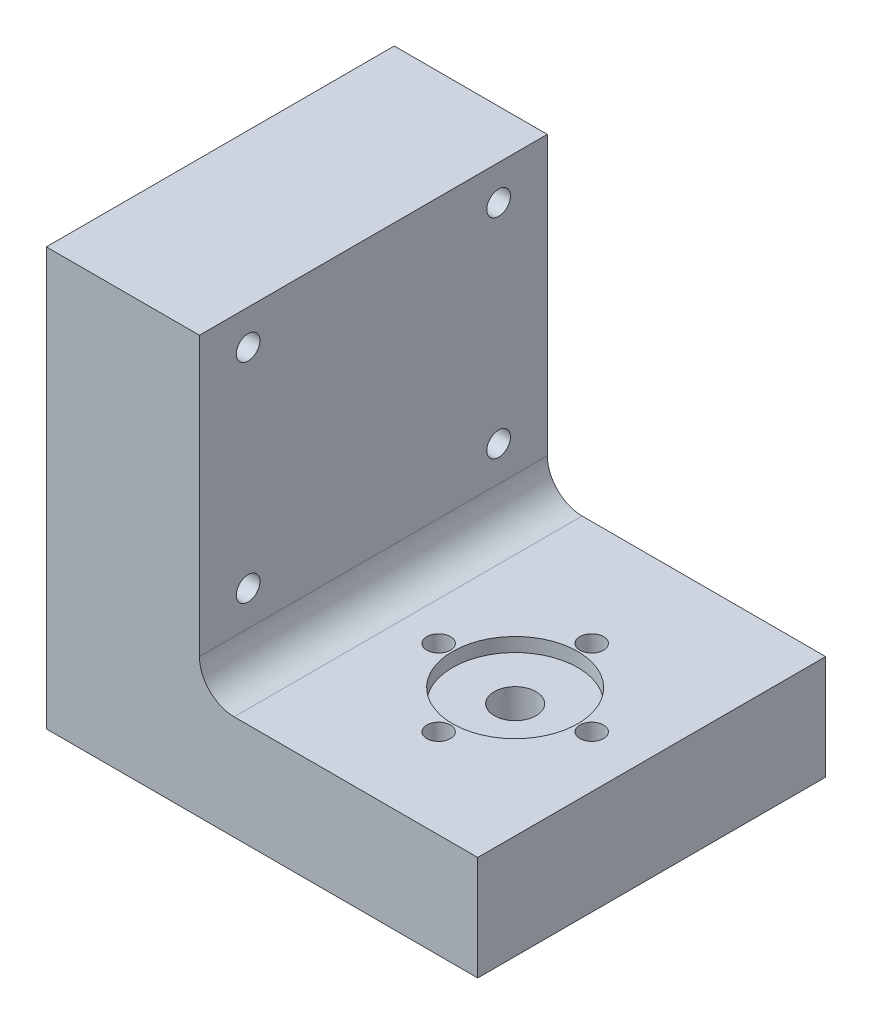
ISO-10303-21;
HEADER;
FILE_DESCRIPTION(('STEP AP214'),'2;1');
FILE_NAME('part.step','',(''),(''),'','','');
FILE_SCHEMA(('AUTOMOTIVE_DESIGN { 1 0 10303 214 1 1 1 1 }'));
ENDSEC;
DATA;
#1=APPLICATION_CONTEXT('core data for automotive mechanical design processes');
#2=APPLICATION_PROTOCOL_DEFINITION('international standard','automotive_design',2000,#1);
#3=PRODUCT_CONTEXT('',#1,'mechanical');
#4=PRODUCT('Part','Part','',(#3));
#5=PRODUCT_RELATED_PRODUCT_CATEGORY('part','',(#4));
#6=PRODUCT_DEFINITION_FORMATION('','',#4);
#7=PRODUCT_DEFINITION_CONTEXT('part definition',#1,'design');
#8=PRODUCT_DEFINITION('design','',#6,#7);
#9=PRODUCT_DEFINITION_SHAPE('','',#8);
#10=(LENGTH_UNIT() NAMED_UNIT(*) SI_UNIT(.MILLI.,.METRE.));
#11=(NAMED_UNIT(*) PLANE_ANGLE_UNIT() SI_UNIT($,.RADIAN.));
#12=(NAMED_UNIT(*) SI_UNIT($,.STERADIAN.) SOLID_ANGLE_UNIT());
#13=UNCERTAINTY_MEASURE_WITH_UNIT(LENGTH_MEASURE(1.E-05),#10,'distance_accuracy_value','');
#14=(GEOMETRIC_REPRESENTATION_CONTEXT(3) GLOBAL_UNCERTAINTY_ASSIGNED_CONTEXT((#13)) GLOBAL_UNIT_ASSIGNED_CONTEXT((#10,
#11,#12)) REPRESENTATION_CONTEXT('',''));
#15=CARTESIAN_POINT('',(0.,0.,0.));
#16=DIRECTION('',(0.,0.,1.));
#17=DIRECTION('',(1.,0.,0.));
#18=AXIS2_PLACEMENT_3D('',#15,#16,#17);
#19=CARTESIAN_POINT('',(-21.5428571428571,31.8,50.));
#20=DIRECTION('',(0.,-1.,0.));
#21=DIRECTION('',(1.,0.,0.));
#22=AXIS2_PLACEMENT_3D('',#19,#20,#21);
#23=PLANE('',#22);
#24=DIRECTION('',(-1.,0.,0.));
#25=VECTOR('',#24,1.);
#26=CARTESIAN_POINT('',(-21.5428571428571,31.8,0.));
#27=LINE('',#26,#25);
#28=CARTESIAN_POINT('',(-21.5428571428571,31.8,0.));
#29=VERTEX_POINT('',#28);
#30=CARTESIAN_POINT('',(-43.5428571428571,31.8,0.));
#31=VERTEX_POINT('',#30);
#32=EDGE_CURVE('E940',#29,#31,#27,.T.);
#33=ORIENTED_EDGE('',*,*,#32,.T.);
#34=DIRECTION('',(0.,0.,-1.));
#35=VECTOR('',#34,1.);
#36=CARTESIAN_POINT('',(-43.5428571428571,31.8,50.));
#37=LINE('',#36,#35);
#38=CARTESIAN_POINT('',(-43.5428571428571,31.8,50.));
#39=VERTEX_POINT('',#38);
#40=EDGE_CURVE('E918',#39,#31,#37,.T.);
#41=ORIENTED_EDGE('',*,*,#40,.F.);
#42=DIRECTION('',(-1.,0.,0.));
#43=VECTOR('',#42,1.);
#44=CARTESIAN_POINT('',(-21.5428571428571,31.8,50.));
#45=LINE('',#44,#43);
#46=CARTESIAN_POINT('',(-21.5428571428571,31.8,50.));
#47=VERTEX_POINT('',#46);
#48=EDGE_CURVE('E922',#47,#39,#45,.T.);
#49=ORIENTED_EDGE('',*,*,#48,.F.);
#50=DIRECTION('',(0.,0.,-1.));
#51=VECTOR('',#50,1.);
#52=CARTESIAN_POINT('',(-21.5428571428571,31.8,50.));
#53=LINE('',#52,#51);
#54=EDGE_CURVE('E962',#47,#29,#53,.T.);
#55=ORIENTED_EDGE('',*,*,#54,.T.);
#56=EDGE_LOOP('',(#33,#41,#49,#55));
#57=FACE_BOUND('',#56,.T.);
#58=ADVANCED_FACE('F853',(#57),#23,.F.);
#59=CARTESIAN_POINT('',(-43.5428571428571,31.8,50.));
#60=DIRECTION('',(1.,0.,0.));
#61=DIRECTION('',(0.,0.,-1.));
#62=AXIS2_PLACEMENT_3D('',#59,#60,#61);
#63=PLANE('',#62);
#64=CARTESIAN_POINT('',(-43.5428571428571,26.8,7.));
#65=DIRECTION('',(1.,0.,0.));
#66=DIRECTION('',(0.,0.,-1.));
#67=AXIS2_PLACEMENT_3D('',#64,#65,#66);
#68=CIRCLE('',#67,1.7);
#69=CARTESIAN_POINT('',(-43.5428571428571,26.8,5.3));
#70=VERTEX_POINT('',#69);
#71=EDGE_CURVE('E983',#70,#70,#68,.T.);
#72=ORIENTED_EDGE('',*,*,#71,.T.);
#73=EDGE_LOOP('',(#72));
#74=FACE_BOUND('',#73,.T.);
#75=CARTESIAN_POINT('',(-43.5428571428571,-3.2,43.));
#76=DIRECTION('',(1.,0.,0.));
#77=DIRECTION('',(0.,0.,-1.));
#78=AXIS2_PLACEMENT_3D('',#75,#76,#77);
#79=CIRCLE('',#78,1.7);
#80=CARTESIAN_POINT('',(-43.5428571428571,-3.2,41.3));
#81=VERTEX_POINT('',#80);
#82=EDGE_CURVE('E999',#81,#81,#79,.T.);
#83=ORIENTED_EDGE('',*,*,#82,.T.);
#84=EDGE_LOOP('',(#83));
#85=FACE_BOUND('',#84,.T.);
#86=CARTESIAN_POINT('',(-43.5428571428571,-3.2,7.));
#87=DIRECTION('',(1.,0.,0.));
#88=DIRECTION('',(0.,0.,-1.));
#89=AXIS2_PLACEMENT_3D('',#86,#87,#88);
#90=CIRCLE('',#89,1.7);
#91=CARTESIAN_POINT('',(-43.5428571428571,-3.2,5.3));
#92=VERTEX_POINT('',#91);
#93=EDGE_CURVE('E1003',#92,#92,#90,.T.);
#94=ORIENTED_EDGE('',*,*,#93,.T.);
#95=EDGE_LOOP('',(#94));
#96=FACE_BOUND('',#95,.T.);
#97=CARTESIAN_POINT('',(-43.5428571428571,26.8,43.));
#98=DIRECTION('',(1.,0.,0.));
#99=DIRECTION('',(0.,0.,-1.));
#100=AXIS2_PLACEMENT_3D('',#97,#98,#99);
#101=CIRCLE('',#100,1.7);
#102=CARTESIAN_POINT('',(-43.5428571428571,26.8,41.3));
#103=VERTEX_POINT('',#102);
#104=EDGE_CURVE('E1004',#103,#103,#101,.T.);
#105=ORIENTED_EDGE('',*,*,#104,.T.);
#106=EDGE_LOOP('',(#105));
#107=FACE_BOUND('',#106,.T.);
#108=DIRECTION('',(0.,-1.,0.));
#109=VECTOR('',#108,1.);
#110=CARTESIAN_POINT('',(-43.5428571428571,31.8,0.));
#111=LINE('',#110,#109);
#112=CARTESIAN_POINT('',(-43.5428571428571,-28.2,0.));
#113=VERTEX_POINT('',#112);
#114=EDGE_CURVE('E978',#31,#113,#111,.T.);
#115=ORIENTED_EDGE('',*,*,#114,.T.);
#116=DIRECTION('',(0.,0.,-1.));
#117=VECTOR('',#116,1.);
#118=CARTESIAN_POINT('',(-43.5428571428571,-28.2,50.));
#119=LINE('',#118,#117);
#120=CARTESIAN_POINT('',(-43.5428571428571,-28.2,50.));
#121=VERTEX_POINT('',#120);
#122=EDGE_CURVE('E919',#121,#113,#119,.T.);
#123=ORIENTED_EDGE('',*,*,#122,.F.);
#124=DIRECTION('',(0.,-1.,0.));
#125=VECTOR('',#124,1.);
#126=CARTESIAN_POINT('',(-43.5428571428571,31.8,50.));
#127=LINE('',#126,#125);
#128=EDGE_CURVE('E912',#39,#121,#127,.T.);
#129=ORIENTED_EDGE('',*,*,#128,.F.);
#130=ORIENTED_EDGE('',*,*,#40,.T.);
#131=EDGE_LOOP('',(#115,#123,#129,#130));
#132=FACE_BOUND('',#131,.T.);
#133=ADVANCED_FACE('F915',(#74,#85,#96,#107,#132),#63,.F.);
#134=CARTESIAN_POINT('',(-43.5428571428571,-28.2,50.));
#135=DIRECTION('',(0.,1.,0.));
#136=DIRECTION('',(-1.,0.,0.));
#137=AXIS2_PLACEMENT_3D('',#134,#135,#136);
#138=PLANE('',#137);
#139=CARTESIAN_POINT('',(0.,-28.2,15.1679359482158));
#140=DIRECTION('',(0.,1.,0.));
#141=DIRECTION('',(-1.,0.,0.));
#142=AXIS2_PLACEMENT_3D('',#139,#140,#141);
#143=CIRCLE('',#142,1.7);
#144=CARTESIAN_POINT('',(-1.69999999999999,-28.2,15.1679359482158));
#145=VERTEX_POINT('',#144);
#146=EDGE_CURVE('E1040',#145,#145,#143,.T.);
#147=ORIENTED_EDGE('',*,*,#146,.T.);
#148=EDGE_LOOP('',(#147));
#149=FACE_BOUND('',#148,.T.);
#150=CARTESIAN_POINT('',(-11.,-28.2,26.1679359482158));
#151=DIRECTION('',(0.,1.,0.));
#152=DIRECTION('',(-1.,0.,0.));
#153=AXIS2_PLACEMENT_3D('',#150,#151,#152);
#154=CIRCLE('',#153,1.7);
#155=CARTESIAN_POINT('',(-12.7,-28.2,26.1679359482158));
#156=VERTEX_POINT('',#155);
#157=EDGE_CURVE('E1055',#156,#156,#154,.T.);
#158=ORIENTED_EDGE('',*,*,#157,.T.);
#159=EDGE_LOOP('',(#158));
#160=FACE_BOUND('',#159,.T.);
#161=CARTESIAN_POINT('',(0.,-28.2,37.1679359482158));
#162=DIRECTION('',(0.,1.,0.));
#163=DIRECTION('',(-1.,0.,0.));
#164=AXIS2_PLACEMENT_3D('',#161,#162,#163);
#165=CIRCLE('',#164,1.7);
#166=CARTESIAN_POINT('',(-1.69999999999999,-28.2,37.1679359482158));
#167=VERTEX_POINT('',#166);
#168=EDGE_CURVE('E1047',#167,#167,#165,.T.);
#169=ORIENTED_EDGE('',*,*,#168,.T.);
#170=EDGE_LOOP('',(#169));
#171=FACE_BOUND('',#170,.T.);
#172=CARTESIAN_POINT('',(11.,-28.2,26.1679359482158));
#173=DIRECTION('',(0.,1.,0.));
#174=DIRECTION('',(-1.,0.,0.));
#175=AXIS2_PLACEMENT_3D('',#172,#173,#174);
#176=CIRCLE('',#175,1.7);
#177=CARTESIAN_POINT('',(9.30000000000001,-28.2,26.1679359482158));
#178=VERTEX_POINT('',#177);
#179=EDGE_CURVE('E1038',#178,#178,#176,.T.);
#180=ORIENTED_EDGE('',*,*,#179,.T.);
#181=EDGE_LOOP('',(#180));
#182=FACE_BOUND('',#181,.T.);
#183=CARTESIAN_POINT('',(0.,-28.2,26.1679359482158));
#184=DIRECTION('',(0.,1.,0.));
#185=DIRECTION('',(-1.,0.,0.));
#186=AXIS2_PLACEMENT_3D('',#183,#184,#185);
#187=CIRCLE('',#186,3.);
#188=CARTESIAN_POINT('',(-2.99999999999999,-28.2,26.1679359482158));
#189=VERTEX_POINT('',#188);
#190=EDGE_CURVE('E1033',#189,#189,#187,.T.);
#191=ORIENTED_EDGE('',*,*,#190,.T.);
#192=EDGE_LOOP('',(#191));
#193=FACE_BOUND('',#192,.T.);
#194=DIRECTION('',(1.,0.,0.));
#195=VECTOR('',#194,1.);
#196=CARTESIAN_POINT('',(-43.5428571428571,-28.2,0.));
#197=LINE('',#196,#195);
#198=CARTESIAN_POINT('',(18.4571428571429,-28.2,0.));
#199=VERTEX_POINT('',#198);
#200=EDGE_CURVE('E972',#113,#199,#197,.T.);
#201=ORIENTED_EDGE('',*,*,#200,.T.);
#202=DIRECTION('',(0.,0.,-1.));
#203=VECTOR('',#202,1.);
#204=CARTESIAN_POINT('',(18.4571428571429,-28.2,50.));
#205=LINE('',#204,#203);
#206=CARTESIAN_POINT('',(18.4571428571429,-28.2,50.));
#207=VERTEX_POINT('',#206);
#208=EDGE_CURVE('E948',#207,#199,#205,.T.);
#209=ORIENTED_EDGE('',*,*,#208,.F.);
#210=DIRECTION('',(1.,0.,0.));
#211=VECTOR('',#210,1.);
#212=CARTESIAN_POINT('',(-43.5428571428571,-28.2,50.));
#213=LINE('',#212,#211);
#214=EDGE_CURVE('E923',#121,#207,#213,.T.);
#215=ORIENTED_EDGE('',*,*,#214,.F.);
#216=ORIENTED_EDGE('',*,*,#122,.T.);
#217=EDGE_LOOP('',(#201,#209,#215,#216));
#218=FACE_BOUND('',#217,.T.);
#219=ADVANCED_FACE('F1073',(#149,#160,#171,#182,#193,#218),#138,.F.);
#220=CARTESIAN_POINT('',(18.4571428571429,-28.2,50.));
#221=DIRECTION('',(-1.,0.,0.));
#222=DIRECTION('',(0.,-1.,0.));
#223=AXIS2_PLACEMENT_3D('',#220,#221,#222);
#224=PLANE('',#223);
#225=DIRECTION('',(0.,1.,0.));
#226=VECTOR('',#225,1.);
#227=CARTESIAN_POINT('',(18.4571428571429,-28.2,0.));
#228=LINE('',#227,#226);
#229=CARTESIAN_POINT('',(18.4571428571429,-13.2,0.));
#230=VERTEX_POINT('',#229);
#231=EDGE_CURVE('E975',#199,#230,#228,.T.);
#232=ORIENTED_EDGE('',*,*,#231,.T.);
#233=DIRECTION('',(0.,0.,-1.));
#234=VECTOR('',#233,1.);
#235=CARTESIAN_POINT('',(18.4571428571429,-13.2,50.));
#236=LINE('',#235,#234);
#237=CARTESIAN_POINT('',(18.4571428571429,-13.2,50.));
#238=VERTEX_POINT('',#237);
#239=EDGE_CURVE('E956',#238,#230,#236,.T.);
#240=ORIENTED_EDGE('',*,*,#239,.F.);
#241=DIRECTION('',(0.,1.,0.));
#242=VECTOR('',#241,1.);
#243=CARTESIAN_POINT('',(18.4571428571429,-28.2,50.));
#244=LINE('',#243,#242);
#245=EDGE_CURVE('E988',#207,#238,#244,.T.);
#246=ORIENTED_EDGE('',*,*,#245,.F.);
#247=ORIENTED_EDGE('',*,*,#208,.T.);
#248=EDGE_LOOP('',(#232,#240,#246,#247));
#249=FACE_BOUND('',#248,.T.);
#250=ADVANCED_FACE('F1082',(#249),#224,.F.);
#251=CARTESIAN_POINT('',(18.4571428571429,-13.2,50.));
#252=DIRECTION('',(0.,-1.,0.));
#253=DIRECTION('',(1.,0.,0.));
#254=AXIS2_PLACEMENT_3D('',#251,#252,#253);
#255=PLANE('',#254);
#256=CARTESIAN_POINT('',(0.,-13.2,15.1679359482158));
#257=DIRECTION('',(0.,1.,0.));
#258=DIRECTION('',(-1.,0.,0.));
#259=AXIS2_PLACEMENT_3D('',#256,#257,#258);
#260=CIRCLE('',#259,1.7);
#261=CARTESIAN_POINT('',(-1.7,-13.2,15.1679359482158));
#262=VERTEX_POINT('',#261);
#263=EDGE_CURVE('E1065',#262,#262,#260,.T.);
#264=ORIENTED_EDGE('',*,*,#263,.F.);
#265=EDGE_LOOP('',(#264));
#266=FACE_BOUND('',#265,.T.);
#267=CARTESIAN_POINT('',(-11.,-13.2,26.1679359482158));
#268=DIRECTION('',(0.,1.,0.));
#269=DIRECTION('',(-1.,0.,0.));
#270=AXIS2_PLACEMENT_3D('',#267,#268,#269);
#271=CIRCLE('',#270,1.7);
#272=CARTESIAN_POINT('',(-12.7,-13.2,26.1679359482158));
#273=VERTEX_POINT('',#272);
#274=EDGE_CURVE('E1056',#273,#273,#271,.T.);
#275=ORIENTED_EDGE('',*,*,#274,.F.);
#276=EDGE_LOOP('',(#275));
#277=FACE_BOUND('',#276,.T.);
#278=CARTESIAN_POINT('',(0.,-13.2,37.1679359482158));
#279=DIRECTION('',(0.,1.,0.));
#280=DIRECTION('',(-1.,0.,0.));
#281=AXIS2_PLACEMENT_3D('',#278,#279,#280);
#282=CIRCLE('',#281,1.7);
#283=CARTESIAN_POINT('',(-1.7,-13.2,37.1679359482158));
#284=VERTEX_POINT('',#283);
#285=EDGE_CURVE('E1048',#284,#284,#282,.T.);
#286=ORIENTED_EDGE('',*,*,#285,.F.);
#287=EDGE_LOOP('',(#286));
#288=FACE_BOUND('',#287,.T.);
#289=CARTESIAN_POINT('',(11.,-13.2,26.1679359482158));
#290=DIRECTION('',(0.,1.,0.));
#291=DIRECTION('',(-1.,0.,0.));
#292=AXIS2_PLACEMENT_3D('',#289,#290,#291);
#293=CIRCLE('',#292,1.7);
#294=CARTESIAN_POINT('',(9.3,-13.2,26.1679359482158));
#295=VERTEX_POINT('',#294);
#296=EDGE_CURVE('E1045',#295,#295,#293,.T.);
#297=ORIENTED_EDGE('',*,*,#296,.F.);
#298=EDGE_LOOP('',(#297));
#299=FACE_BOUND('',#298,.T.);
#300=CARTESIAN_POINT('',(0.,-13.2,26.1679359482158));
#301=DIRECTION('',(0.,1.,0.));
#302=DIRECTION('',(-1.,0.,0.));
#303=AXIS2_PLACEMENT_3D('',#300,#301,#302);
#304=CIRCLE('',#303,9.);
#305=CARTESIAN_POINT('',(-9.,-13.2,26.1679359482158));
#306=VERTEX_POINT('',#305);
#307=EDGE_CURVE('E1028',#306,#306,#304,.T.);
#308=ORIENTED_EDGE('',*,*,#307,.F.);
#309=EDGE_LOOP('',(#308));
#310=FACE_BOUND('',#309,.T.);
#311=DIRECTION('',(-1.,0.,0.));
#312=VECTOR('',#311,1.);
#313=CARTESIAN_POINT('',(18.4571428571429,-13.2,0.));
#314=LINE('',#313,#312);
#315=CARTESIAN_POINT('',(-16.5428571428571,-13.2,0.));
#316=VERTEX_POINT('',#315);
#317=EDGE_CURVE('E970',#230,#316,#314,.T.);
#318=ORIENTED_EDGE('',*,*,#317,.T.);
#319=DIRECTION('',(0.,0.,-1.));
#320=VECTOR('',#319,1.);
#321=CARTESIAN_POINT('',(-16.5428571428571,-13.2,50.));
#322=LINE('',#321,#320);
#323=CARTESIAN_POINT('',(-16.5428571428571,-13.2,50.));
#324=VERTEX_POINT('',#323);
#325=EDGE_CURVE('E868',#316,#324,#322,.F.);
#326=ORIENTED_EDGE('',*,*,#325,.T.);
#327=DIRECTION('',(-1.,0.,0.));
#328=VECTOR('',#327,1.);
#329=CARTESIAN_POINT('',(18.4571428571429,-13.2,50.));
#330=LINE('',#329,#328);
#331=EDGE_CURVE('E986',#238,#324,#330,.T.);
#332=ORIENTED_EDGE('',*,*,#331,.F.);
#333=ORIENTED_EDGE('',*,*,#239,.T.);
#334=EDGE_LOOP('',(#318,#326,#332,#333));
#335=FACE_BOUND('',#334,.T.);
#336=ADVANCED_FACE('F1083',(#266,#277,#288,#299,#310,#335),#255,.F.);
#337=CARTESIAN_POINT('',(-21.5428571428571,-13.2,50.));
#338=DIRECTION('',(-1.,0.,0.));
#339=DIRECTION('',(0.,-1.,0.));
#340=AXIS2_PLACEMENT_3D('',#337,#338,#339);
#341=PLANE('',#340);
#342=CARTESIAN_POINT('',(-21.5428571428571,26.8,7.));
#343=DIRECTION('',(1.,0.,0.));
#344=DIRECTION('',(0.,1.,0.));
#345=AXIS2_PLACEMENT_3D('',#342,#343,#344);
#346=CIRCLE('',#345,1.7);
#347=CARTESIAN_POINT('',(-21.5428571428571,28.5,7.));
#348=VERTEX_POINT('',#347);
#349=EDGE_CURVE('E1012',#348,#348,#346,.T.);
#350=ORIENTED_EDGE('',*,*,#349,.F.);
#351=EDGE_LOOP('',(#350));
#352=FACE_BOUND('',#351,.T.);
#353=CARTESIAN_POINT('',(-21.5428571428571,-3.2,43.));
#354=DIRECTION('',(1.,0.,0.));
#355=DIRECTION('',(0.,1.,0.));
#356=AXIS2_PLACEMENT_3D('',#353,#354,#355);
#357=CIRCLE('',#356,1.7);
#358=CARTESIAN_POINT('',(-21.5428571428571,-1.5,43.));
#359=VERTEX_POINT('',#358);
#360=EDGE_CURVE('E1015',#359,#359,#357,.T.);
#361=ORIENTED_EDGE('',*,*,#360,.F.);
#362=EDGE_LOOP('',(#361));
#363=FACE_BOUND('',#362,.T.);
#364=CARTESIAN_POINT('',(-21.5428571428571,-3.2,7.));
#365=DIRECTION('',(1.,0.,0.));
#366=DIRECTION('',(0.,1.,0.));
#367=AXIS2_PLACEMENT_3D('',#364,#365,#366);
#368=CIRCLE('',#367,1.7);
#369=CARTESIAN_POINT('',(-21.5428571428571,-1.5,7.));
#370=VERTEX_POINT('',#369);
#371=EDGE_CURVE('E1016',#370,#370,#368,.T.);
#372=ORIENTED_EDGE('',*,*,#371,.F.);
#373=EDGE_LOOP('',(#372));
#374=FACE_BOUND('',#373,.T.);
#375=CARTESIAN_POINT('',(-21.5428571428571,26.8,43.));
#376=DIRECTION('',(1.,0.,0.));
#377=DIRECTION('',(0.,1.,0.));
#378=AXIS2_PLACEMENT_3D('',#375,#376,#377);
#379=CIRCLE('',#378,1.7);
#380=CARTESIAN_POINT('',(-21.5428571428571,28.5,43.));
#381=VERTEX_POINT('',#380);
#382=EDGE_CURVE('E1009',#381,#381,#379,.T.);
#383=ORIENTED_EDGE('',*,*,#382,.F.);
#384=EDGE_LOOP('',(#383));
#385=FACE_BOUND('',#384,.T.);
#386=DIRECTION('',(0.,1.,0.));
#387=VECTOR('',#386,1.);
#388=CARTESIAN_POINT('',(-21.5428571428571,-13.2,50.));
#389=LINE('',#388,#387);
#390=CARTESIAN_POINT('',(-21.5428571428571,-8.2,50.));
#391=VERTEX_POINT('',#390);
#392=EDGE_CURVE('E927',#391,#47,#389,.T.);
#393=ORIENTED_EDGE('',*,*,#392,.F.);
#394=DIRECTION('',(0.,0.,-1.));
#395=VECTOR('',#394,1.);
#396=CARTESIAN_POINT('',(-21.5428571428571,-8.2,0.));
#397=LINE('',#396,#395);
#398=CARTESIAN_POINT('',(-21.5428571428571,-8.2,0.));
#399=VERTEX_POINT('',#398);
#400=EDGE_CURVE('E936',#391,#399,#397,.T.);
#401=ORIENTED_EDGE('',*,*,#400,.T.);
#402=DIRECTION('',(0.,1.,0.));
#403=VECTOR('',#402,1.);
#404=CARTESIAN_POINT('',(-21.5428571428571,-13.2,0.));
#405=LINE('',#404,#403);
#406=EDGE_CURVE('E933',#399,#29,#405,.T.);
#407=ORIENTED_EDGE('',*,*,#406,.T.);
#408=ORIENTED_EDGE('',*,*,#54,.F.);
#409=EDGE_LOOP('',(#393,#401,#407,#408));
#410=FACE_BOUND('',#409,.T.);
#411=ADVANCED_FACE('F1084',(#352,#363,#374,#385,#410),#341,.F.);
#412=CARTESIAN_POINT('',(0.,0.,50.));
#413=DIRECTION('',(0.,0.,1.));
#414=DIRECTION('',(1.,0.,0.));
#415=AXIS2_PLACEMENT_3D('',#412,#413,#414);
#416=PLANE('',#415);
#417=ORIENTED_EDGE('',*,*,#48,.T.);
#418=ORIENTED_EDGE('',*,*,#128,.T.);
#419=ORIENTED_EDGE('',*,*,#214,.T.);
#420=ORIENTED_EDGE('',*,*,#245,.T.);
#421=ORIENTED_EDGE('',*,*,#331,.T.);
#422=CARTESIAN_POINT('',(-16.5428571428571,-8.2,50.));
#423=DIRECTION('',(0.,0.,1.));
#424=DIRECTION('',(1.,0.,0.));
#425=AXIS2_PLACEMENT_3D('',#422,#423,#424);
#426=CIRCLE('',#425,5.);
#427=EDGE_CURVE('E12',#324,#391,#426,.F.);
#428=ORIENTED_EDGE('',*,*,#427,.T.);
#429=ORIENTED_EDGE('',*,*,#392,.T.);
#430=EDGE_LOOP('',(#417,#418,#419,#420,#421,#428,#429));
#431=FACE_BOUND('',#430,.T.);
#432=ADVANCED_FACE('F930',(#431),#416,.T.);
#433=CARTESIAN_POINT('',(0.,0.,0.));
#434=DIRECTION('',(0.,0.,1.));
#435=DIRECTION('',(1.,0.,0.));
#436=AXIS2_PLACEMENT_3D('',#433,#434,#435);
#437=PLANE('',#436);
#438=ORIENTED_EDGE('',*,*,#32,.F.);
#439=ORIENTED_EDGE('',*,*,#406,.F.);
#440=CARTESIAN_POINT('',(-16.5428571428571,-8.2,0.));
#441=DIRECTION('',(0.,0.,1.));
#442=DIRECTION('',(1.,0.,0.));
#443=AXIS2_PLACEMENT_3D('',#440,#441,#442);
#444=CIRCLE('',#443,5.);
#445=EDGE_CURVE('E863',#399,#316,#444,.T.);
#446=ORIENTED_EDGE('',*,*,#445,.T.);
#447=ORIENTED_EDGE('',*,*,#317,.F.);
#448=ORIENTED_EDGE('',*,*,#231,.F.);
#449=ORIENTED_EDGE('',*,*,#200,.F.);
#450=ORIENTED_EDGE('',*,*,#114,.F.);
#451=EDGE_LOOP('',(#438,#439,#446,#447,#448,#449,#450));
#452=FACE_BOUND('',#451,.T.);
#453=ADVANCED_FACE('F1099',(#452),#437,.F.);
#454=CARTESIAN_POINT('',(-16.5428571428571,-8.2,50.));
#455=DIRECTION('',(0.,0.,1.));
#456=DIRECTION('',(1.,0.,0.));
#457=AXIS2_PLACEMENT_3D('',#454,#455,#456);
#458=CYLINDRICAL_SURFACE('',#457,5.);
#459=ORIENTED_EDGE('',*,*,#427,.F.);
#460=ORIENTED_EDGE('',*,*,#325,.F.);
#461=ORIENTED_EDGE('',*,*,#445,.F.);
#462=ORIENTED_EDGE('',*,*,#400,.F.);
#463=EDGE_LOOP('',(#459,#460,#461,#462));
#464=FACE_BOUND('',#463,.T.);
#465=ADVANCED_FACE('F851',(#464),#458,.F.);
#466=CARTESIAN_POINT('',(-71.5428571428572,26.8,43.));
#467=DIRECTION('',(1.,0.,0.));
#468=DIRECTION('',(0.,1.,0.));
#469=AXIS2_PLACEMENT_3D('',#466,#467,#468);
#470=CYLINDRICAL_SURFACE('',#469,1.7);
#471=ORIENTED_EDGE('',*,*,#382,.T.);
#472=EDGE_LOOP('',(#471));
#473=FACE_BOUND('',#472,.T.);
#474=ORIENTED_EDGE('',*,*,#104,.F.);
#475=EDGE_LOOP('',(#474));
#476=FACE_BOUND('',#475,.T.);
#477=ADVANCED_FACE('F1133',(#473,#476),#470,.F.);
#478=CARTESIAN_POINT('',(-71.5428571428571,-3.2,7.));
#479=DIRECTION('',(1.,0.,0.));
#480=DIRECTION('',(0.,1.,0.));
#481=AXIS2_PLACEMENT_3D('',#478,#479,#480);
#482=CYLINDRICAL_SURFACE('',#481,1.7);
#483=ORIENTED_EDGE('',*,*,#371,.T.);
#484=EDGE_LOOP('',(#483));
#485=FACE_BOUND('',#484,.T.);
#486=ORIENTED_EDGE('',*,*,#93,.F.);
#487=EDGE_LOOP('',(#486));
#488=FACE_BOUND('',#487,.T.);
#489=ADVANCED_FACE('F1131',(#485,#488),#482,.F.);
#490=CARTESIAN_POINT('',(-71.5428571428571,-3.2,43.));
#491=DIRECTION('',(1.,0.,0.));
#492=DIRECTION('',(0.,1.,0.));
#493=AXIS2_PLACEMENT_3D('',#490,#491,#492);
#494=CYLINDRICAL_SURFACE('',#493,1.7);
#495=ORIENTED_EDGE('',*,*,#360,.T.);
#496=EDGE_LOOP('',(#495));
#497=FACE_BOUND('',#496,.T.);
#498=ORIENTED_EDGE('',*,*,#82,.F.);
#499=EDGE_LOOP('',(#498));
#500=FACE_BOUND('',#499,.T.);
#501=ADVANCED_FACE('F1139',(#497,#500),#494,.F.);
#502=CARTESIAN_POINT('',(-71.5428571428572,26.8,7.));
#503=DIRECTION('',(1.,0.,0.));
#504=DIRECTION('',(0.,1.,0.));
#505=AXIS2_PLACEMENT_3D('',#502,#503,#504);
#506=CYLINDRICAL_SURFACE('',#505,1.7);
#507=ORIENTED_EDGE('',*,*,#349,.T.);
#508=EDGE_LOOP('',(#507));
#509=FACE_BOUND('',#508,.T.);
#510=ORIENTED_EDGE('',*,*,#71,.F.);
#511=EDGE_LOOP('',(#510));
#512=FACE_BOUND('',#511,.T.);
#513=ADVANCED_FACE('F1164',(#509,#512),#506,.F.);
#514=CARTESIAN_POINT('',(0.,-15.2,26.1679359482158));
#515=DIRECTION('',(0.,1.,0.));
#516=DIRECTION('',(-1.,0.,0.));
#517=AXIS2_PLACEMENT_3D('',#514,#515,#516);
#518=CYLINDRICAL_SURFACE('',#517,9.);
#519=CARTESIAN_POINT('',(0.,-15.2,26.1679359482158));
#520=DIRECTION('',(0.,1.,0.));
#521=DIRECTION('',(-1.,0.,0.));
#522=AXIS2_PLACEMENT_3D('',#519,#520,#521);
#523=CIRCLE('',#522,9.);
#524=CARTESIAN_POINT('',(-8.99999999999999,-15.2,26.1679359482158));
#525=VERTEX_POINT('',#524);
#526=EDGE_CURVE('E1024',#525,#525,#523,.T.);
#527=ORIENTED_EDGE('',*,*,#526,.F.);
#528=EDGE_LOOP('',(#527));
#529=FACE_BOUND('',#528,.T.);
#530=ORIENTED_EDGE('',*,*,#307,.T.);
#531=EDGE_LOOP('',(#530));
#532=FACE_BOUND('',#531,.T.);
#533=ADVANCED_FACE('F1168',(#529,#532),#518,.F.);
#534=CARTESIAN_POINT('',(0.,-15.2,0.));
#535=DIRECTION('',(0.,1.,0.));
#536=DIRECTION('',(-1.,0.,0.));
#537=AXIS2_PLACEMENT_3D('',#534,#535,#536);
#538=PLANE('',#537);
#539=CARTESIAN_POINT('',(0.,-15.2,26.1679359482158));
#540=DIRECTION('',(0.,1.,0.));
#541=DIRECTION('',(-1.,0.,0.));
#542=AXIS2_PLACEMENT_3D('',#539,#540,#541);
#543=CIRCLE('',#542,3.);
#544=CARTESIAN_POINT('',(-3.,-15.2,26.1679359482158));
#545=VERTEX_POINT('',#544);
#546=EDGE_CURVE('E854',#545,#545,#543,.T.);
#547=ORIENTED_EDGE('',*,*,#546,.F.);
#548=EDGE_LOOP('',(#547));
#549=FACE_BOUND('',#548,.T.);
#550=ORIENTED_EDGE('',*,*,#526,.T.);
#551=EDGE_LOOP('',(#550));
#552=FACE_BOUND('',#551,.T.);
#553=ADVANCED_FACE('F1172',(#549,#552),#538,.T.);
#554=CARTESIAN_POINT('',(0.,-28.2,26.1679359482158));
#555=DIRECTION('',(0.,1.,0.));
#556=DIRECTION('',(-1.,0.,0.));
#557=AXIS2_PLACEMENT_3D('',#554,#555,#556);
#558=CYLINDRICAL_SURFACE('',#557,3.);
#559=ORIENTED_EDGE('',*,*,#546,.T.);
#560=EDGE_LOOP('',(#559));
#561=FACE_BOUND('',#560,.T.);
#562=ORIENTED_EDGE('',*,*,#190,.F.);
#563=EDGE_LOOP('',(#562));
#564=FACE_BOUND('',#563,.T.);
#565=ADVANCED_FACE('F1177',(#561,#564),#558,.F.);
#566=CARTESIAN_POINT('',(11.,-28.2,26.1679359482158));
#567=DIRECTION('',(0.,1.,0.));
#568=DIRECTION('',(-1.,0.,0.));
#569=AXIS2_PLACEMENT_3D('',#566,#567,#568);
#570=CYLINDRICAL_SURFACE('',#569,1.7);
#571=ORIENTED_EDGE('',*,*,#179,.F.);
#572=EDGE_LOOP('',(#571));
#573=FACE_BOUND('',#572,.T.);
#574=ORIENTED_EDGE('',*,*,#296,.T.);
#575=EDGE_LOOP('',(#574));
#576=FACE_BOUND('',#575,.T.);
#577=ADVANCED_FACE('F1185',(#573,#576),#570,.F.);
#578=CARTESIAN_POINT('',(0.,-28.2,37.1679359482158));
#579=DIRECTION('',(0.,1.,0.));
#580=DIRECTION('',(-1.,0.,0.));
#581=AXIS2_PLACEMENT_3D('',#578,#579,#580);
#582=CYLINDRICAL_SURFACE('',#581,1.7);
#583=ORIENTED_EDGE('',*,*,#168,.F.);
#584=EDGE_LOOP('',(#583));
#585=FACE_BOUND('',#584,.T.);
#586=ORIENTED_EDGE('',*,*,#285,.T.);
#587=EDGE_LOOP('',(#586));
#588=FACE_BOUND('',#587,.T.);
#589=ADVANCED_FACE('F1188',(#585,#588),#582,.F.);
#590=CARTESIAN_POINT('',(-11.,-28.2,26.1679359482158));
#591=DIRECTION('',(0.,1.,0.));
#592=DIRECTION('',(-1.,0.,0.));
#593=AXIS2_PLACEMENT_3D('',#590,#591,#592);
#594=CYLINDRICAL_SURFACE('',#593,1.7);
#595=ORIENTED_EDGE('',*,*,#157,.F.);
#596=EDGE_LOOP('',(#595));
#597=FACE_BOUND('',#596,.T.);
#598=ORIENTED_EDGE('',*,*,#274,.T.);
#599=EDGE_LOOP('',(#598));
#600=FACE_BOUND('',#599,.T.);
#601=ADVANCED_FACE('F1077',(#597,#600),#594,.F.);
#602=CARTESIAN_POINT('',(0.,-28.2,15.1679359482158));
#603=DIRECTION('',(0.,1.,0.));
#604=DIRECTION('',(-1.,0.,0.));
#605=AXIS2_PLACEMENT_3D('',#602,#603,#604);
#606=CYLINDRICAL_SURFACE('',#605,1.7);
#607=ORIENTED_EDGE('',*,*,#146,.F.);
#608=EDGE_LOOP('',(#607));
#609=FACE_BOUND('',#608,.T.);
#610=ORIENTED_EDGE('',*,*,#263,.T.);
#611=EDGE_LOOP('',(#610));
#612=FACE_BOUND('',#611,.T.);
#613=ADVANCED_FACE('F1072',(#609,#612),#606,.F.);
#614=CLOSED_SHELL('',(#58,#133,#219,#250,#336,#411,#432,#453,#465,#477,#489,#501,#513,#533,#553,
#565,#577,#589,#601,#613));
#615=MANIFOLD_SOLID_BREP('B2',#614);
#616=ADVANCED_BREP_SHAPE_REPRESENTATION('',(#18,#615),#14);
#617=SHAPE_DEFINITION_REPRESENTATION(#9,#616);
ENDSEC;
END-ISO-10303-21;
